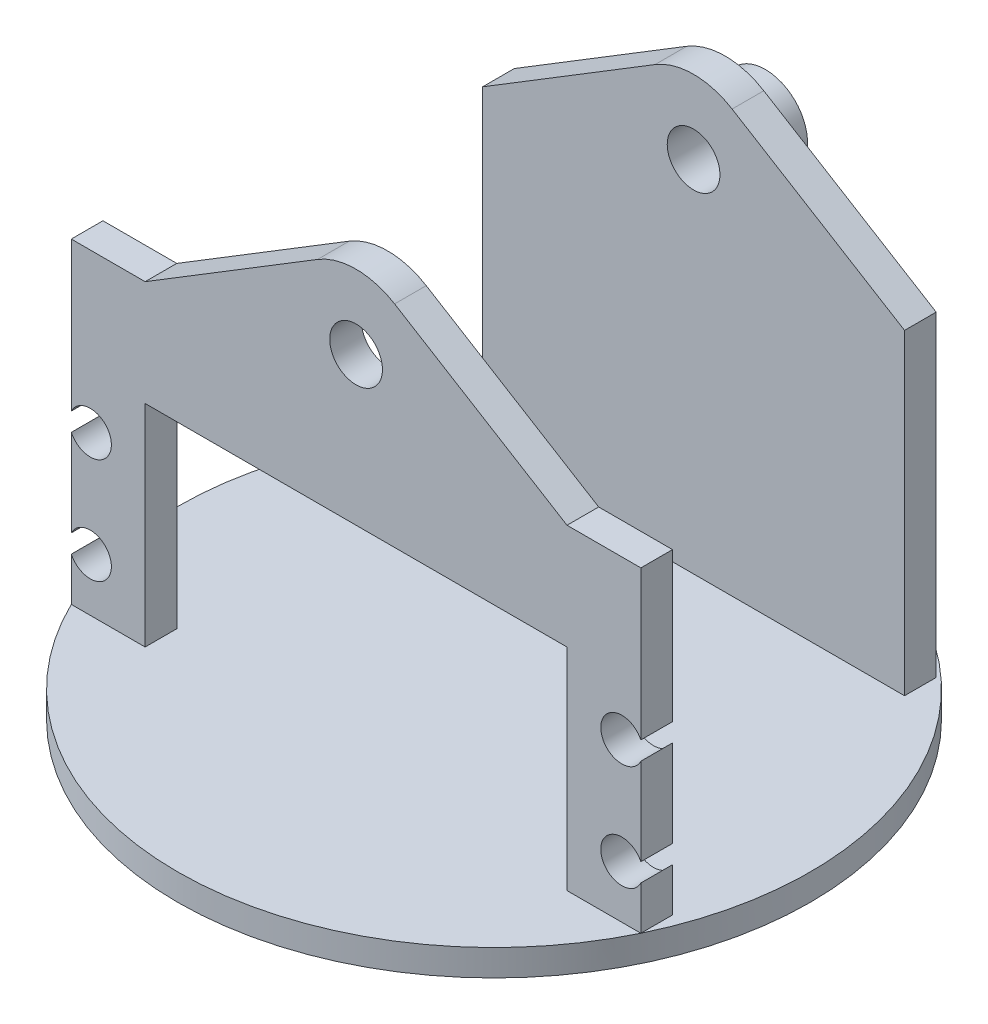
ISO-10303-21;
HEADER;
FILE_DESCRIPTION(('STEP AP214'),'2;1');
FILE_NAME('part.step','',(''),(''),'','','');
FILE_SCHEMA(('AUTOMOTIVE_DESIGN { 1 0 10303 214 1 1 1 1 }'));
ENDSEC;
DATA;
#1=APPLICATION_CONTEXT('core data for automotive mechanical design processes');
#2=APPLICATION_PROTOCOL_DEFINITION('international standard','automotive_design',2000,#1);
#3=PRODUCT_CONTEXT('',#1,'mechanical');
#4=PRODUCT('Part','Part','',(#3));
#5=PRODUCT_RELATED_PRODUCT_CATEGORY('part','',(#4));
#6=PRODUCT_DEFINITION_FORMATION('','',#4);
#7=PRODUCT_DEFINITION_CONTEXT('part definition',#1,'design');
#8=PRODUCT_DEFINITION('design','',#6,#7);
#9=PRODUCT_DEFINITION_SHAPE('','',#8);
#10=(LENGTH_UNIT() NAMED_UNIT(*) SI_UNIT(.MILLI.,.METRE.));
#11=(NAMED_UNIT(*) PLANE_ANGLE_UNIT() SI_UNIT($,.RADIAN.));
#12=(NAMED_UNIT(*) SI_UNIT($,.STERADIAN.) SOLID_ANGLE_UNIT());
#13=UNCERTAINTY_MEASURE_WITH_UNIT(LENGTH_MEASURE(1.E-05),#10,'distance_accuracy_value','');
#14=(GEOMETRIC_REPRESENTATION_CONTEXT(3) GLOBAL_UNCERTAINTY_ASSIGNED_CONTEXT((#13)) GLOBAL_UNIT_ASSIGNED_CONTEXT((#10,
#11,#12)) REPRESENTATION_CONTEXT('',''));
#15=CARTESIAN_POINT('',(0.,0.,0.));
#16=DIRECTION('',(0.,0.,1.));
#17=DIRECTION('',(1.,0.,0.));
#18=AXIS2_PLACEMENT_3D('',#15,#16,#17);
#19=CARTESIAN_POINT('',(0.,36.0286627923346,-21.923303169378));
#20=DIRECTION('',(0.,0.,-1.));
#21=DIRECTION('',(-1.,0.,0.));
#22=AXIS2_PLACEMENT_3D('',#19,#20,#21);
#23=PLANE('',#22);
#24=DIRECTION('',(-1.,0.,0.));
#25=VECTOR('',#24,1.);
#26=CARTESIAN_POINT('',(-20.,2.,-21.923303169378));
#27=LINE('',#26,#25);
#28=CARTESIAN_POINT('',(20.,2.,-21.923303169378));
#29=VERTEX_POINT('',#28);
#30=CARTESIAN_POINT('',(-20.,2.,-21.923303169378));
#31=VERTEX_POINT('',#30);
#32=EDGE_CURVE('E301',#29,#31,#27,.T.);
#33=ORIENTED_EDGE('',*,*,#32,.T.);
#34=DIRECTION('',(0.,1.,0.));
#35=VECTOR('',#34,1.);
#36=CARTESIAN_POINT('',(-20.,32.,-21.923303169378));
#37=LINE('',#36,#35);
#38=CARTESIAN_POINT('',(-20.,32.,-21.923303169378));
#39=VERTEX_POINT('',#38);
#40=EDGE_CURVE('E290',#31,#39,#37,.T.);
#41=ORIENTED_EDGE('',*,*,#40,.T.);
#42=DIRECTION('',(0.853048172523639,0.521832171635748,0.));
#43=VECTOR('',#42,1.);
#44=CARTESIAN_POINT('',(-3.65282520145023,42.,-21.923303169378));
#45=LINE('',#44,#43);
#46=CARTESIAN_POINT('',(-3.65282520145023,42.,-21.923303169378));
#47=VERTEX_POINT('',#46);
#48=EDGE_CURVE('E300',#39,#47,#45,.T.);
#49=ORIENTED_EDGE('',*,*,#48,.T.);
#50=CARTESIAN_POINT('',(0.,36.0286627923346,-21.923303169378));
#51=DIRECTION('',(0.,0.,-1.));
#52=DIRECTION('',(-1.,0.,0.));
#53=AXIS2_PLACEMENT_3D('',#50,#51,#52);
#54=CIRCLE('',#53,6.99999999999999);
#55=CARTESIAN_POINT('',(3.65282520145023,42.,-21.923303169378));
#56=VERTEX_POINT('',#55);
#57=EDGE_CURVE('E789',#47,#56,#54,.T.);
#58=ORIENTED_EDGE('',*,*,#57,.T.);
#59=DIRECTION('',(0.853048172523639,-0.521832171635747,0.));
#60=VECTOR('',#59,1.);
#61=CARTESIAN_POINT('',(20.,32.,-21.923303169378));
#62=LINE('',#61,#60);
#63=CARTESIAN_POINT('',(20.,32.,-21.923303169378));
#64=VERTEX_POINT('',#63);
#65=EDGE_CURVE('E792',#56,#64,#62,.T.);
#66=ORIENTED_EDGE('',*,*,#65,.T.);
#67=DIRECTION('',(0.,-1.,0.));
#68=VECTOR('',#67,1.);
#69=CARTESIAN_POINT('',(20.,2.,-21.923303169378));
#70=LINE('',#69,#68);
#71=EDGE_CURVE('E306',#64,#29,#70,.T.);
#72=ORIENTED_EDGE('',*,*,#71,.T.);
#73=EDGE_LOOP('',(#33,#41,#49,#58,#66,#72));
#74=FACE_BOUND('',#73,.T.);
#75=CARTESIAN_POINT('',(0.,36.0286627923346,-21.923303169378));
#76=DIRECTION('',(0.,0.,-1.));
#77=DIRECTION('',(-1.,0.,0.));
#78=AXIS2_PLACEMENT_3D('',#75,#76,#77);
#79=CIRCLE('',#78,4.);
#80=CARTESIAN_POINT('',(-4.,36.0286627923346,-21.923303169378));
#81=VERTEX_POINT('',#80);
#82=EDGE_CURVE('E777',#81,#81,#79,.T.);
#83=ORIENTED_EDGE('',*,*,#82,.F.);
#84=EDGE_LOOP('',(#83));
#85=FACE_BOUND('',#84,.T.);
#86=ADVANCED_FACE('F115',(#74,#85),#23,.T.);
#87=CARTESIAN_POINT('',(0.,2.,0.));
#88=DIRECTION('',(0.,1.,0.));
#89=DIRECTION('',(-1.,0.,0.));
#90=AXIS2_PLACEMENT_3D('',#87,#88,#89);
#91=PLANE('',#90);
#92=CARTESIAN_POINT('',(0.,2.00000000000001,0.));
#93=DIRECTION('',(0.,1.,0.));
#94=DIRECTION('',(-1.,0.,0.));
#95=AXIS2_PLACEMENT_3D('',#92,#93,#94);
#96=CIRCLE('',#95,30.);
#97=CARTESIAN_POINT('',(27.,2.00000000000001,13.076696830622));
#98=VERTEX_POINT('',#97);
#99=CARTESIAN_POINT('',(-27.,2.,13.076696830622));
#100=VERTEX_POINT('',#99);
#101=EDGE_CURVE('E511',#98,#100,#96,.T.);
#102=ORIENTED_EDGE('',*,*,#101,.T.);
#103=DIRECTION('',(0.,0.,-1.));
#104=VECTOR('',#103,1.);
#105=CARTESIAN_POINT('',(-27.,1.99999999999999,0.));
#106=LINE('',#105,#104);
#107=CARTESIAN_POINT('',(-27.,1.99999999999999,10.076696830622));
#108=VERTEX_POINT('',#107);
#109=EDGE_CURVE('E464',#100,#108,#106,.T.);
#110=ORIENTED_EDGE('',*,*,#109,.T.);
#111=DIRECTION('',(-1.,0.,0.));
#112=VECTOR('',#111,1.);
#113=CARTESIAN_POINT('',(0.,2.,10.076696830622));
#114=LINE('',#113,#112);
#115=CARTESIAN_POINT('',(-20.,2.,10.076696830622));
#116=VERTEX_POINT('',#115);
#117=EDGE_CURVE('E459',#116,#108,#114,.T.);
#118=ORIENTED_EDGE('',*,*,#117,.F.);
#119=DIRECTION('',(0.,0.,1.));
#120=VECTOR('',#119,1.);
#121=CARTESIAN_POINT('',(-20.,2.,-30.001));
#122=LINE('',#121,#120);
#123=CARTESIAN_POINT('',(-20.,2.,13.076696830622));
#124=VERTEX_POINT('',#123);
#125=EDGE_CURVE('E420',#116,#124,#122,.T.);
#126=ORIENTED_EDGE('',*,*,#125,.T.);
#127=DIRECTION('',(-1.,0.,0.));
#128=VECTOR('',#127,1.);
#129=CARTESIAN_POINT('',(0.,2.,13.076696830622));
#130=LINE('',#129,#128);
#131=EDGE_CURVE('E432',#124,#100,#130,.T.);
#132=ORIENTED_EDGE('',*,*,#131,.T.);
#133=EDGE_CURVE('E512',#100,#98,#96,.T.);
#134=ORIENTED_EDGE('',*,*,#133,.T.);
#135=CARTESIAN_POINT('',(20.,2.,13.076696830622));
#136=VERTEX_POINT('',#135);
#137=EDGE_CURVE('E451',#98,#136,#130,.T.);
#138=ORIENTED_EDGE('',*,*,#137,.T.);
#139=DIRECTION('',(0.,0.,1.));
#140=VECTOR('',#139,1.);
#141=CARTESIAN_POINT('',(20.,2.,-30.001));
#142=LINE('',#141,#140);
#143=CARTESIAN_POINT('',(20.,2.,10.076696830622));
#144=VERTEX_POINT('',#143);
#145=EDGE_CURVE('E416',#144,#136,#142,.T.);
#146=ORIENTED_EDGE('',*,*,#145,.F.);
#147=CARTESIAN_POINT('',(27.,2.00000000000001,10.076696830622));
#148=VERTEX_POINT('',#147);
#149=EDGE_CURVE('E460',#148,#144,#114,.T.);
#150=ORIENTED_EDGE('',*,*,#149,.F.);
#151=DIRECTION('',(0.,0.,-1.));
#152=VECTOR('',#151,1.);
#153=CARTESIAN_POINT('',(27.,2.00000000000001,0.));
#154=LINE('',#153,#152);
#155=EDGE_CURVE('E455',#98,#148,#154,.T.);
#156=ORIENTED_EDGE('',*,*,#155,.F.);
#157=EDGE_LOOP('',(#102,#110,#118,#126,#132,#134,#138,#146,#150,#156));
#158=FACE_BOUND('',#157,.T.);
#159=DIRECTION('',(-1.,0.,0.));
#160=VECTOR('',#159,1.);
#161=CARTESIAN_POINT('',(-20.,2.,-18.923303169378));
#162=LINE('',#161,#160);
#163=CARTESIAN_POINT('',(20.,2.00000000000001,-18.923303169378));
#164=VERTEX_POINT('',#163);
#165=CARTESIAN_POINT('',(-20.,2.,-18.923303169378));
#166=VERTEX_POINT('',#165);
#167=EDGE_CURVE('E131',#164,#166,#162,.T.);
#168=ORIENTED_EDGE('',*,*,#167,.T.);
#169=DIRECTION('',(0.,0.,1.));
#170=VECTOR('',#169,1.);
#171=CARTESIAN_POINT('',(-20.,2.,-21.923303169378));
#172=LINE('',#171,#170);
#173=EDGE_CURVE('E294',#31,#166,#172,.T.);
#174=ORIENTED_EDGE('',*,*,#173,.F.);
#175=ORIENTED_EDGE('',*,*,#32,.F.);
#176=DIRECTION('',(0.,0.,1.));
#177=VECTOR('',#176,1.);
#178=CARTESIAN_POINT('',(20.,2.,-21.923303169378));
#179=LINE('',#178,#177);
#180=EDGE_CURVE('E797',#29,#164,#179,.T.);
#181=ORIENTED_EDGE('',*,*,#180,.T.);
#182=EDGE_LOOP('',(#168,#174,#175,#181));
#183=FACE_BOUND('',#182,.T.);
#184=ADVANCED_FACE('F313',(#158,#183),#91,.T.);
#185=CARTESIAN_POINT('',(0.,32.,0.));
#186=DIRECTION('',(0.,1.,0.));
#187=DIRECTION('',(-1.,0.,0.));
#188=AXIS2_PLACEMENT_3D('',#185,#186,#187);
#189=PLANE('',#188);
#190=DIRECTION('',(-1.,0.,0.));
#191=VECTOR('',#190,1.);
#192=CARTESIAN_POINT('',(0.,32.,10.076696830622));
#193=LINE('',#192,#191);
#194=CARTESIAN_POINT('',(27.,32.,10.076696830622));
#195=VERTEX_POINT('',#194);
#196=CARTESIAN_POINT('',(20.,32.,10.076696830622));
#197=VERTEX_POINT('',#196);
#198=EDGE_CURVE('E442',#195,#197,#193,.T.);
#199=ORIENTED_EDGE('',*,*,#198,.T.);
#200=DIRECTION('',(0.,0.,1.));
#201=VECTOR('',#200,1.);
#202=CARTESIAN_POINT('',(20.,32.,10.076696830622));
#203=LINE('',#202,#201);
#204=CARTESIAN_POINT('',(20.,32.,13.076696830622));
#205=VERTEX_POINT('',#204);
#206=EDGE_CURVE('E336',#197,#205,#203,.T.);
#207=ORIENTED_EDGE('',*,*,#206,.T.);
#208=DIRECTION('',(-1.,0.,0.));
#209=VECTOR('',#208,1.);
#210=CARTESIAN_POINT('',(0.,32.,13.076696830622));
#211=LINE('',#210,#209);
#212=CARTESIAN_POINT('',(27.,32.,13.076696830622));
#213=VERTEX_POINT('',#212);
#214=EDGE_CURVE('E433',#213,#205,#211,.T.);
#215=ORIENTED_EDGE('',*,*,#214,.F.);
#216=DIRECTION('',(0.,0.,-1.));
#217=VECTOR('',#216,1.);
#218=CARTESIAN_POINT('',(27.,32.,0.));
#219=LINE('',#218,#217);
#220=EDGE_CURVE('E437',#213,#195,#219,.T.);
#221=ORIENTED_EDGE('',*,*,#220,.T.);
#222=EDGE_LOOP('',(#199,#207,#215,#221));
#223=FACE_BOUND('',#222,.T.);
#224=ADVANCED_FACE('F623',(#223),#189,.T.);
#225=CARTESIAN_POINT('',(27.,32.,0.));
#226=DIRECTION('',(-1.,0.,0.));
#227=DIRECTION('',(0.,-1.,0.));
#228=AXIS2_PLACEMENT_3D('',#225,#226,#227);
#229=PLANE('',#228);
#230=DIRECTION('',(0.,0.,1.));
#231=VECTOR('',#230,1.);
#232=CARTESIAN_POINT('',(27.,16.1282202112919,3.07669683062201));
#233=LINE('',#232,#231);
#234=CARTESIAN_POINT('',(27.,16.1282202112919,10.076696830622));
#235=VERTEX_POINT('',#234);
#236=CARTESIAN_POINT('',(27.,16.1282202112919,13.076696830622));
#237=VERTEX_POINT('',#236);
#238=EDGE_CURVE('E368',#235,#237,#233,.T.);
#239=ORIENTED_EDGE('',*,*,#238,.T.);
#240=DIRECTION('',(0.,-1.,0.));
#241=VECTOR('',#240,1.);
#242=CARTESIAN_POINT('',(27.,32.,13.076696830622));
#243=LINE('',#242,#241);
#244=CARTESIAN_POINT('',(27.,7.87177978870814,13.076696830622));
#245=VERTEX_POINT('',#244);
#246=EDGE_CURVE('E491',#237,#245,#243,.T.);
#247=ORIENTED_EDGE('',*,*,#246,.T.);
#248=DIRECTION('',(0.,0.,1.));
#249=VECTOR('',#248,1.);
#250=CARTESIAN_POINT('',(27.,7.87177978870814,3.07669683062201));
#251=LINE('',#250,#249);
#252=CARTESIAN_POINT('',(27.,7.87177978870814,10.076696830622));
#253=VERTEX_POINT('',#252);
#254=EDGE_CURVE('E378',#253,#245,#251,.T.);
#255=ORIENTED_EDGE('',*,*,#254,.F.);
#256=DIRECTION('',(0.,-1.,0.));
#257=VECTOR('',#256,1.);
#258=CARTESIAN_POINT('',(27.,32.,10.076696830622));
#259=LINE('',#258,#257);
#260=EDGE_CURVE('E485',#235,#253,#259,.T.);
#261=ORIENTED_EDGE('',*,*,#260,.F.);
#262=EDGE_LOOP('',(#239,#247,#255,#261));
#263=FACE_BOUND('',#262,.T.);
#264=ADVANCED_FACE('F538',(#263),#229,.F.);
#265=DIRECTION('',(0.,0.,1.));
#266=VECTOR('',#265,1.);
#267=CARTESIAN_POINT('',(27.,17.8717797887081,3.07669683062201));
#268=LINE('',#267,#266);
#269=CARTESIAN_POINT('',(27.,17.8717797887081,10.076696830622));
#270=VERTEX_POINT('',#269);
#271=CARTESIAN_POINT('',(27.,17.8717797887081,13.076696830622));
#272=VERTEX_POINT('',#271);
#273=EDGE_CURVE('E366',#270,#272,#268,.T.);
#274=ORIENTED_EDGE('',*,*,#273,.F.);
#275=EDGE_CURVE('E480',#195,#270,#259,.T.);
#276=ORIENTED_EDGE('',*,*,#275,.F.);
#277=ORIENTED_EDGE('',*,*,#220,.F.);
#278=EDGE_CURVE('E486',#213,#272,#243,.T.);
#279=ORIENTED_EDGE('',*,*,#278,.T.);
#280=EDGE_LOOP('',(#274,#276,#277,#279));
#281=FACE_BOUND('',#280,.T.);
#282=ADVANCED_FACE('F628',(#281),#229,.F.);
#283=DIRECTION('',(0.,0.,1.));
#284=VECTOR('',#283,1.);
#285=CARTESIAN_POINT('',(27.,6.12822021129186,3.07669683062201));
#286=LINE('',#285,#284);
#287=CARTESIAN_POINT('',(27.,6.12822021129185,10.076696830622));
#288=VERTEX_POINT('',#287);
#289=CARTESIAN_POINT('',(27.,6.12822021129186,13.076696830622));
#290=VERTEX_POINT('',#289);
#291=EDGE_CURVE('E367',#288,#290,#286,.T.);
#292=ORIENTED_EDGE('',*,*,#291,.T.);
#293=EDGE_CURVE('E484',#290,#98,#243,.T.);
#294=ORIENTED_EDGE('',*,*,#293,.T.);
#295=ORIENTED_EDGE('',*,*,#155,.T.);
#296=EDGE_CURVE('E478',#288,#148,#259,.T.);
#297=ORIENTED_EDGE('',*,*,#296,.F.);
#298=EDGE_LOOP('',(#292,#294,#295,#297));
#299=FACE_BOUND('',#298,.T.);
#300=ADVANCED_FACE('F552',(#299),#229,.F.);
#301=CARTESIAN_POINT('',(-27.,32.,0.));
#302=DIRECTION('',(-1.,0.,0.));
#303=DIRECTION('',(0.,0.,1.));
#304=AXIS2_PLACEMENT_3D('',#301,#302,#303);
#305=PLANE('',#304);
#306=DIRECTION('',(0.,0.,1.));
#307=VECTOR('',#306,1.);
#308=CARTESIAN_POINT('',(-27.,16.1282202112919,3.07669683062201));
#309=LINE('',#308,#307);
#310=CARTESIAN_POINT('',(-27.,16.1282202112919,10.076696830622));
#311=VERTEX_POINT('',#310);
#312=CARTESIAN_POINT('',(-27.,16.1282202112919,13.076696830622));
#313=VERTEX_POINT('',#312);
#314=EDGE_CURVE('E525',#311,#313,#309,.T.);
#315=ORIENTED_EDGE('',*,*,#314,.F.);
#316=DIRECTION('',(0.,-1.,0.));
#317=VECTOR('',#316,1.);
#318=CARTESIAN_POINT('',(-27.,32.,10.076696830622));
#319=LINE('',#318,#317);
#320=CARTESIAN_POINT('',(-27.,7.87177978870814,10.076696830622));
#321=VERTEX_POINT('',#320);
#322=EDGE_CURVE('E479',#311,#321,#319,.T.);
#323=ORIENTED_EDGE('',*,*,#322,.T.);
#324=DIRECTION('',(0.,0.,1.));
#325=VECTOR('',#324,1.);
#326=CARTESIAN_POINT('',(-27.,7.87177978870815,3.07669683062201));
#327=LINE('',#326,#325);
#328=CARTESIAN_POINT('',(-27.,7.87177978870814,13.076696830622));
#329=VERTEX_POINT('',#328);
#330=EDGE_CURVE('E516',#329,#321,#327,.F.);
#331=ORIENTED_EDGE('',*,*,#330,.F.);
#332=DIRECTION('',(0.,-1.,0.));
#333=VECTOR('',#332,1.);
#334=CARTESIAN_POINT('',(-27.,32.,13.076696830622));
#335=LINE('',#334,#333);
#336=EDGE_CURVE('E473',#313,#329,#335,.T.);
#337=ORIENTED_EDGE('',*,*,#336,.F.);
#338=EDGE_LOOP('',(#315,#323,#331,#337));
#339=FACE_BOUND('',#338,.T.);
#340=ADVANCED_FACE('F590',(#339),#305,.T.);
#341=DIRECTION('',(0.,0.,1.));
#342=VECTOR('',#341,1.);
#343=CARTESIAN_POINT('',(-27.,6.12822021129184,3.07669683062201));
#344=LINE('',#343,#342);
#345=CARTESIAN_POINT('',(-27.,6.12822021129186,10.076696830622));
#346=VERTEX_POINT('',#345);
#347=CARTESIAN_POINT('',(-27.,6.12822021129186,13.076696830622));
#348=VERTEX_POINT('',#347);
#349=EDGE_CURVE('E519',#346,#348,#344,.T.);
#350=ORIENTED_EDGE('',*,*,#349,.F.);
#351=EDGE_CURVE('E472',#346,#108,#319,.T.);
#352=ORIENTED_EDGE('',*,*,#351,.T.);
#353=ORIENTED_EDGE('',*,*,#109,.F.);
#354=EDGE_CURVE('E450',#348,#100,#335,.T.);
#355=ORIENTED_EDGE('',*,*,#354,.F.);
#356=EDGE_LOOP('',(#350,#352,#353,#355));
#357=FACE_BOUND('',#356,.T.);
#358=ADVANCED_FACE('F568',(#357),#305,.T.);
#359=CARTESIAN_POINT('',(-2.9,0.,0.));
#360=DIRECTION('',(0.,-1.,0.));
#361=DIRECTION('',(1.,0.,0.));
#362=AXIS2_PLACEMENT_3D('',#359,#360,#361);
#363=PLANE('',#362);
#364=CARTESIAN_POINT('',(0.,0.,0.));
#365=DIRECTION('',(0.,1.,0.));
#366=DIRECTION('',(-1.,0.,0.));
#367=AXIS2_PLACEMENT_3D('',#364,#365,#366);
#368=CIRCLE('',#367,2.89999999999999);
#369=CARTESIAN_POINT('',(-2.9,0.,0.));
#370=VERTEX_POINT('',#369);
#371=EDGE_CURVE('E490',#370,#370,#368,.T.);
#372=ORIENTED_EDGE('',*,*,#371,.F.);
#373=EDGE_LOOP('',(#372));
#374=FACE_BOUND('',#373,.T.);
#375=ADVANCED_FACE('F117',(#374),#363,.T.);
#376=CARTESIAN_POINT('',(0.,5.26927704004386,0.));
#377=DIRECTION('',(0.,1.,0.));
#378=DIRECTION('',(-1.,0.,0.));
#379=AXIS2_PLACEMENT_3D('',#376,#377,#378);
#380=CYLINDRICAL_SURFACE('',#379,30.);
#381=CARTESIAN_POINT('',(0.,-0.499999999999991,0.));
#382=DIRECTION('',(0.,1.,0.));
#383=DIRECTION('',(-1.,0.,0.));
#384=AXIS2_PLACEMENT_3D('',#381,#382,#383);
#385=CIRCLE('',#384,30.);
#386=CARTESIAN_POINT('',(-30.,-0.5,0.));
#387=VERTEX_POINT('',#386);
#388=EDGE_CURVE('E507',#387,#387,#385,.T.);
#389=ORIENTED_EDGE('',*,*,#388,.T.);
#390=EDGE_LOOP('',(#389));
#391=FACE_BOUND('',#390,.T.);
#392=ORIENTED_EDGE('',*,*,#133,.F.);
#393=ORIENTED_EDGE('',*,*,#101,.F.);
#394=EDGE_LOOP('',(#392,#393));
#395=FACE_BOUND('',#394,.T.);
#396=ADVANCED_FACE('F563',(#391,#395),#380,.T.);
#397=CARTESIAN_POINT('',(-30.,-0.500000000000004,0.));
#398=DIRECTION('',(0.,-1.,0.));
#399=DIRECTION('',(1.,0.,0.));
#400=AXIS2_PLACEMENT_3D('',#397,#398,#399);
#401=PLANE('',#400);
#402=CARTESIAN_POINT('',(0.,-0.499999999999999,0.));
#403=DIRECTION('',(0.,1.,0.));
#404=DIRECTION('',(-1.,0.,0.));
#405=AXIS2_PLACEMENT_3D('',#402,#403,#404);
#406=CIRCLE('',#405,5.5);
#407=CARTESIAN_POINT('',(-5.5,-0.5,0.));
#408=VERTEX_POINT('',#407);
#409=EDGE_CURVE('E503',#408,#408,#406,.T.);
#410=ORIENTED_EDGE('',*,*,#409,.T.);
#411=EDGE_LOOP('',(#410));
#412=FACE_BOUND('',#411,.T.);
#413=ORIENTED_EDGE('',*,*,#388,.F.);
#414=EDGE_LOOP('',(#413));
#415=FACE_BOUND('',#414,.T.);
#416=ADVANCED_FACE('F1010',(#412,#415),#401,.T.);
#417=CARTESIAN_POINT('',(0.,5.26927704004386,0.));
#418=DIRECTION('',(0.,1.,0.));
#419=DIRECTION('',(-1.,0.,0.));
#420=AXIS2_PLACEMENT_3D('',#417,#418,#419);
#421=CYLINDRICAL_SURFACE('',#420,5.5);
#422=CARTESIAN_POINT('',(0.,-2.75,0.));
#423=DIRECTION('',(0.,1.,0.));
#424=DIRECTION('',(-1.,0.,0.));
#425=AXIS2_PLACEMENT_3D('',#422,#423,#424);
#426=CIRCLE('',#425,5.5);
#427=CARTESIAN_POINT('',(-5.5,-2.75,0.));
#428=VERTEX_POINT('',#427);
#429=EDGE_CURVE('E499',#428,#428,#426,.T.);
#430=ORIENTED_EDGE('',*,*,#429,.T.);
#431=EDGE_LOOP('',(#430));
#432=FACE_BOUND('',#431,.T.);
#433=ORIENTED_EDGE('',*,*,#409,.F.);
#434=EDGE_LOOP('',(#433));
#435=FACE_BOUND('',#434,.T.);
#436=ADVANCED_FACE('F1001',(#432,#435),#421,.T.);
#437=CARTESIAN_POINT('',(-5.5,-2.75,0.));
#438=DIRECTION('',(0.,-1.,0.));
#439=DIRECTION('',(1.,0.,0.));
#440=AXIS2_PLACEMENT_3D('',#437,#438,#439);
#441=PLANE('',#440);
#442=CARTESIAN_POINT('',(0.,-2.75,0.));
#443=DIRECTION('',(0.,1.,0.));
#444=DIRECTION('',(-1.,0.,0.));
#445=AXIS2_PLACEMENT_3D('',#442,#443,#444);
#446=CIRCLE('',#445,2.9);
#447=CARTESIAN_POINT('',(-2.9,-2.75,0.));
#448=VERTEX_POINT('',#447);
#449=EDGE_CURVE('E495',#448,#448,#446,.T.);
#450=ORIENTED_EDGE('',*,*,#449,.T.);
#451=EDGE_LOOP('',(#450));
#452=FACE_BOUND('',#451,.T.);
#453=ORIENTED_EDGE('',*,*,#429,.F.);
#454=EDGE_LOOP('',(#453));
#455=FACE_BOUND('',#454,.T.);
#456=ADVANCED_FACE('F992',(#452,#455),#441,.T.);
#457=CARTESIAN_POINT('',(0.,5.26927704004386,0.));
#458=DIRECTION('',(0.,1.,0.));
#459=DIRECTION('',(-1.,0.,0.));
#460=AXIS2_PLACEMENT_3D('',#457,#458,#459);
#461=CYLINDRICAL_SURFACE('',#460,2.9);
#462=ORIENTED_EDGE('',*,*,#371,.T.);
#463=EDGE_LOOP('',(#462));
#464=FACE_BOUND('',#463,.T.);
#465=ORIENTED_EDGE('',*,*,#449,.F.);
#466=EDGE_LOOP('',(#465));
#467=FACE_BOUND('',#466,.T.);
#468=ADVANCED_FACE('F984',(#464,#467),#461,.F.);
#469=CARTESIAN_POINT('',(0.,32.,13.076696830622));
#470=DIRECTION('',(0.,0.,1.));
#471=DIRECTION('',(1.,0.,0.));
#472=AXIS2_PLACEMENT_3D('',#469,#470,#471);
#473=PLANE('',#472);
#474=ORIENTED_EDGE('',*,*,#246,.F.);
#475=CARTESIAN_POINT('',(25.2,17.,13.076696830622));
#476=DIRECTION('',(0.,0.,-1.));
#477=DIRECTION('',(-1.,0.,0.));
#478=AXIS2_PLACEMENT_3D('',#475,#476,#477);
#479=CIRCLE('',#478,2.);
#480=EDGE_CURVE('E362',#237,#272,#479,.T.);
#481=ORIENTED_EDGE('',*,*,#480,.T.);
#482=ORIENTED_EDGE('',*,*,#278,.F.);
#483=ORIENTED_EDGE('',*,*,#214,.T.);
#484=DIRECTION('',(0.853048172523639,-0.521832171635747,0.));
#485=VECTOR('',#484,1.);
#486=CARTESIAN_POINT('',(19.6909116791749,32.1890775162278,13.076696830622));
#487=LINE('',#486,#485);
#488=CARTESIAN_POINT('',(3.65282520145023,42.,13.076696830622));
#489=VERTEX_POINT('',#488);
#490=EDGE_CURVE('E139',#489,#205,#487,.T.);
#491=ORIENTED_EDGE('',*,*,#490,.F.);
#492=CARTESIAN_POINT('',(0.,36.0286627923346,13.076696830622));
#493=DIRECTION('',(0.,0.,1.));
#494=DIRECTION('',(1.,0.,0.));
#495=AXIS2_PLACEMENT_3D('',#492,#493,#494);
#496=CIRCLE('',#495,7.);
#497=CARTESIAN_POINT('',(-3.65282520145023,42.,13.076696830622));
#498=VERTEX_POINT('',#497);
#499=EDGE_CURVE('E337',#489,#498,#496,.T.);
#500=ORIENTED_EDGE('',*,*,#499,.T.);
#501=DIRECTION('',(0.853048172523639,0.521832171635748,0.));
#502=VECTOR('',#501,1.);
#503=CARTESIAN_POINT('',(-20.,32.,13.076696830622));
#504=LINE('',#503,#502);
#505=CARTESIAN_POINT('',(-20.,32.,13.076696830622));
#506=VERTEX_POINT('',#505);
#507=EDGE_CURVE('E315',#506,#498,#504,.T.);
#508=ORIENTED_EDGE('',*,*,#507,.F.);
#509=CARTESIAN_POINT('',(-27.,32.,13.076696830622));
#510=VERTEX_POINT('',#509);
#511=EDGE_CURVE('E438',#506,#510,#211,.T.);
#512=ORIENTED_EDGE('',*,*,#511,.T.);
#513=CARTESIAN_POINT('',(-27.,17.8717797887081,13.076696830622));
#514=VERTEX_POINT('',#513);
#515=EDGE_CURVE('E468',#510,#514,#335,.T.);
#516=ORIENTED_EDGE('',*,*,#515,.T.);
#517=CARTESIAN_POINT('',(-25.2,17.,13.076696830622));
#518=DIRECTION('',(0.,0.,1.));
#519=DIRECTION('',(1.,0.,0.));
#520=AXIS2_PLACEMENT_3D('',#517,#518,#519);
#521=CIRCLE('',#520,2.);
#522=EDGE_CURVE('E384',#313,#514,#521,.T.);
#523=ORIENTED_EDGE('',*,*,#522,.F.);
#524=ORIENTED_EDGE('',*,*,#336,.T.);
#525=CARTESIAN_POINT('',(-25.2,7.,13.076696830622));
#526=DIRECTION('',(0.,0.,1.));
#527=DIRECTION('',(1.,0.,0.));
#528=AXIS2_PLACEMENT_3D('',#525,#526,#527);
#529=CIRCLE('',#528,2.);
#530=EDGE_CURVE('E372',#348,#329,#529,.T.);
#531=ORIENTED_EDGE('',*,*,#530,.F.);
#532=ORIENTED_EDGE('',*,*,#354,.T.);
#533=ORIENTED_EDGE('',*,*,#131,.F.);
#534=DIRECTION('',(0.,-1.,0.));
#535=VECTOR('',#534,1.);
#536=CARTESIAN_POINT('',(-20.,22.,13.076696830622));
#537=LINE('',#536,#535);
#538=CARTESIAN_POINT('',(-20.,22.,13.076696830622));
#539=VERTEX_POINT('',#538);
#540=EDGE_CURVE('E411',#539,#124,#537,.T.);
#541=ORIENTED_EDGE('',*,*,#540,.F.);
#542=DIRECTION('',(-1.,0.,0.));
#543=VECTOR('',#542,1.);
#544=CARTESIAN_POINT('',(20.,22.,13.076696830622));
#545=LINE('',#544,#543);
#546=CARTESIAN_POINT('',(20.,22.,13.076696830622));
#547=VERTEX_POINT('',#546);
#548=EDGE_CURVE('E407',#547,#539,#545,.T.);
#549=ORIENTED_EDGE('',*,*,#548,.F.);
#550=DIRECTION('',(0.,1.,0.));
#551=VECTOR('',#550,1.);
#552=CARTESIAN_POINT('',(20.,22.,13.076696830622));
#553=LINE('',#552,#551);
#554=EDGE_CURVE('E404',#136,#547,#553,.T.);
#555=ORIENTED_EDGE('',*,*,#554,.F.);
#556=ORIENTED_EDGE('',*,*,#137,.F.);
#557=ORIENTED_EDGE('',*,*,#293,.F.);
#558=CARTESIAN_POINT('',(25.2,7.,13.076696830622));
#559=DIRECTION('',(0.,0.,-1.));
#560=DIRECTION('',(-1.,0.,0.));
#561=AXIS2_PLACEMENT_3D('',#558,#559,#560);
#562=CIRCLE('',#561,2.);
#563=EDGE_CURVE('E350',#290,#245,#562,.T.);
#564=ORIENTED_EDGE('',*,*,#563,.T.);
#565=EDGE_LOOP('',(#474,#481,#482,#483,#491,#500,#508,#512,#516,#523,#524,#531,#532,#533,#541,
#549,#555,#556,#557,#564));
#566=FACE_BOUND('',#565,.T.);
#567=CARTESIAN_POINT('',(0.,36.0286627923346,13.076696830622));
#568=DIRECTION('',(0.,0.,1.));
#569=DIRECTION('',(1.,0.,0.));
#570=AXIS2_PLACEMENT_3D('',#567,#568,#569);
#571=CIRCLE('',#570,2.5);
#572=CARTESIAN_POINT('',(2.5,36.0286627923346,13.076696830622));
#573=VERTEX_POINT('',#572);
#574=EDGE_CURVE('E340',#573,#573,#571,.T.);
#575=ORIENTED_EDGE('',*,*,#574,.F.);
#576=EDGE_LOOP('',(#575));
#577=FACE_BOUND('',#576,.T.);
#578=ADVANCED_FACE('F578',(#566,#577),#473,.T.);
#579=CARTESIAN_POINT('',(0.,32.,10.076696830622));
#580=DIRECTION('',(0.,0.,1.));
#581=DIRECTION('',(1.,0.,0.));
#582=AXIS2_PLACEMENT_3D('',#579,#580,#581);
#583=PLANE('',#582);
#584=CARTESIAN_POINT('',(25.2,17.,10.076696830622));
#585=DIRECTION('',(0.,0.,1.));
#586=DIRECTION('',(1.,0.,0.));
#587=AXIS2_PLACEMENT_3D('',#584,#585,#586);
#588=CIRCLE('',#587,2.);
#589=EDGE_CURVE('E12',#235,#270,#588,.F.);
#590=ORIENTED_EDGE('',*,*,#589,.F.);
#591=ORIENTED_EDGE('',*,*,#260,.T.);
#592=CARTESIAN_POINT('',(25.2,7.,10.076696830622));
#593=DIRECTION('',(0.,0.,1.));
#594=DIRECTION('',(1.,0.,0.));
#595=AXIS2_PLACEMENT_3D('',#592,#593,#594);
#596=CIRCLE('',#595,2.);
#597=EDGE_CURVE('E124',#288,#253,#596,.F.);
#598=ORIENTED_EDGE('',*,*,#597,.F.);
#599=ORIENTED_EDGE('',*,*,#296,.T.);
#600=ORIENTED_EDGE('',*,*,#149,.T.);
#601=DIRECTION('',(0.,-1.,0.));
#602=VECTOR('',#601,1.);
#603=CARTESIAN_POINT('',(20.,22.,10.076696830622));
#604=LINE('',#603,#602);
#605=CARTESIAN_POINT('',(20.,22.,10.076696830622));
#606=VERTEX_POINT('',#605);
#607=EDGE_CURVE('E400',#606,#144,#604,.T.);
#608=ORIENTED_EDGE('',*,*,#607,.F.);
#609=DIRECTION('',(1.,0.,0.));
#610=VECTOR('',#609,1.);
#611=CARTESIAN_POINT('',(20.,22.,10.076696830622));
#612=LINE('',#611,#610);
#613=CARTESIAN_POINT('',(-20.,22.,10.076696830622));
#614=VERTEX_POINT('',#613);
#615=EDGE_CURVE('E419',#614,#606,#612,.T.);
#616=ORIENTED_EDGE('',*,*,#615,.F.);
#617=DIRECTION('',(0.,1.,0.));
#618=VECTOR('',#617,1.);
#619=CARTESIAN_POINT('',(-20.,22.,10.076696830622));
#620=LINE('',#619,#618);
#621=EDGE_CURVE('E397',#116,#614,#620,.T.);
#622=ORIENTED_EDGE('',*,*,#621,.F.);
#623=ORIENTED_EDGE('',*,*,#117,.T.);
#624=ORIENTED_EDGE('',*,*,#351,.F.);
#625=CARTESIAN_POINT('',(-25.2,7.,10.076696830622));
#626=DIRECTION('',(0.,0.,1.));
#627=DIRECTION('',(1.,0.,0.));
#628=AXIS2_PLACEMENT_3D('',#625,#626,#627);
#629=CIRCLE('',#628,2.);
#630=EDGE_CURVE('E387',#346,#321,#629,.T.);
#631=ORIENTED_EDGE('',*,*,#630,.T.);
#632=ORIENTED_EDGE('',*,*,#322,.F.);
#633=CARTESIAN_POINT('',(-25.2,17.,10.076696830622));
#634=DIRECTION('',(0.,0.,1.));
#635=DIRECTION('',(1.,0.,0.));
#636=AXIS2_PLACEMENT_3D('',#633,#634,#635);
#637=CIRCLE('',#636,2.);
#638=CARTESIAN_POINT('',(-27.,17.8717797887081,10.076696830622));
#639=VERTEX_POINT('',#638);
#640=EDGE_CURVE('E393',#311,#639,#637,.T.);
#641=ORIENTED_EDGE('',*,*,#640,.T.);
#642=CARTESIAN_POINT('',(-27.,32.,10.076696830622));
#643=VERTEX_POINT('',#642);
#644=EDGE_CURVE('E474',#643,#639,#319,.T.);
#645=ORIENTED_EDGE('',*,*,#644,.F.);
#646=CARTESIAN_POINT('',(-20.,32.,10.076696830622));
#647=VERTEX_POINT('',#646);
#648=EDGE_CURVE('E441',#647,#643,#193,.T.);
#649=ORIENTED_EDGE('',*,*,#648,.F.);
#650=DIRECTION('',(0.853048172523639,0.521832171635748,0.));
#651=VECTOR('',#650,1.);
#652=CARTESIAN_POINT('',(-20.,32.,10.076696830622));
#653=LINE('',#652,#651);
#654=CARTESIAN_POINT('',(-3.65282520145023,42.,10.076696830622));
#655=VERTEX_POINT('',#654);
#656=EDGE_CURVE('E320',#647,#655,#653,.T.);
#657=ORIENTED_EDGE('',*,*,#656,.T.);
#658=CARTESIAN_POINT('',(0.,36.0286627923346,10.076696830622));
#659=DIRECTION('',(0.,0.,1.));
#660=DIRECTION('',(1.,0.,0.));
#661=AXIS2_PLACEMENT_3D('',#658,#659,#660);
#662=CIRCLE('',#661,7.);
#663=CARTESIAN_POINT('',(3.65282520145023,42.,10.076696830622));
#664=VERTEX_POINT('',#663);
#665=EDGE_CURVE('E326',#664,#655,#662,.T.);
#666=ORIENTED_EDGE('',*,*,#665,.F.);
#667=DIRECTION('',(0.853048172523639,-0.521832171635747,0.));
#668=VECTOR('',#667,1.);
#669=CARTESIAN_POINT('',(19.6909116791749,32.1890775162278,10.076696830622));
#670=LINE('',#669,#668);
#671=EDGE_CURVE('E333',#664,#197,#670,.T.);
#672=ORIENTED_EDGE('',*,*,#671,.T.);
#673=ORIENTED_EDGE('',*,*,#198,.F.);
#674=ORIENTED_EDGE('',*,*,#275,.T.);
#675=EDGE_LOOP('',(#590,#591,#598,#599,#600,#608,#616,#622,#623,#624,#631,#632,#641,#645,#649,
#657,#666,#672,#673,#674));
#676=FACE_BOUND('',#675,.T.);
#677=CARTESIAN_POINT('',(0.,36.0286627923346,10.076696830622));
#678=DIRECTION('',(0.,0.,1.));
#679=DIRECTION('',(1.,0.,0.));
#680=AXIS2_PLACEMENT_3D('',#677,#678,#679);
#681=CIRCLE('',#680,2.5);
#682=CARTESIAN_POINT('',(2.5,36.0286627923346,10.076696830622));
#683=VERTEX_POINT('',#682);
#684=EDGE_CURVE('E329',#683,#683,#681,.T.);
#685=ORIENTED_EDGE('',*,*,#684,.T.);
#686=EDGE_LOOP('',(#685));
#687=FACE_BOUND('',#686,.T.);
#688=ADVANCED_FACE('F541',(#676,#687),#583,.F.);
#689=DIRECTION('',(0.,0.,1.));
#690=VECTOR('',#689,1.);
#691=CARTESIAN_POINT('',(-27.,17.8717797887081,3.07669683062201));
#692=LINE('',#691,#690);
#693=EDGE_CURVE('E522',#514,#639,#692,.F.);
#694=ORIENTED_EDGE('',*,*,#693,.F.);
#695=ORIENTED_EDGE('',*,*,#515,.F.);
#696=DIRECTION('',(0.,0.,-1.));
#697=VECTOR('',#696,1.);
#698=CARTESIAN_POINT('',(-27.,32.,0.));
#699=LINE('',#698,#697);
#700=EDGE_CURVE('E446',#510,#643,#699,.T.);
#701=ORIENTED_EDGE('',*,*,#700,.T.);
#702=ORIENTED_EDGE('',*,*,#644,.T.);
#703=EDGE_LOOP('',(#694,#695,#701,#702));
#704=FACE_BOUND('',#703,.T.);
#705=ADVANCED_FACE('F601',(#704),#305,.T.);
#706=DIRECTION('',(0.,0.,1.));
#707=VECTOR('',#706,1.);
#708=CARTESIAN_POINT('',(-20.,32.,10.076696830622));
#709=LINE('',#708,#707);
#710=EDGE_CURVE('E355',#647,#506,#709,.T.);
#711=ORIENTED_EDGE('',*,*,#710,.F.);
#712=ORIENTED_EDGE('',*,*,#648,.T.);
#713=ORIENTED_EDGE('',*,*,#700,.F.);
#714=ORIENTED_EDGE('',*,*,#511,.F.);
#715=EDGE_LOOP('',(#711,#712,#713,#714));
#716=FACE_BOUND('',#715,.T.);
#717=ADVANCED_FACE('F607',(#716),#189,.T.);
#718=CARTESIAN_POINT('',(20.,22.,-30.001));
#719=DIRECTION('',(1.,0.,0.));
#720=DIRECTION('',(0.,0.,-1.));
#721=AXIS2_PLACEMENT_3D('',#718,#719,#720);
#722=PLANE('',#721);
#723=ORIENTED_EDGE('',*,*,#607,.T.);
#724=ORIENTED_EDGE('',*,*,#145,.T.);
#725=ORIENTED_EDGE('',*,*,#554,.T.);
#726=DIRECTION('',(0.,0.,1.));
#727=VECTOR('',#726,1.);
#728=CARTESIAN_POINT('',(20.,22.,-30.001));
#729=LINE('',#728,#727);
#730=EDGE_CURVE('E415',#606,#547,#729,.T.);
#731=ORIENTED_EDGE('',*,*,#730,.F.);
#732=EDGE_LOOP('',(#723,#724,#725,#731));
#733=FACE_BOUND('',#732,.T.);
#734=ADVANCED_FACE('F949',(#733),#722,.F.);
#735=CARTESIAN_POINT('',(-20.,22.,-30.001));
#736=DIRECTION('',(-1.,0.,0.));
#737=DIRECTION('',(0.,0.,1.));
#738=AXIS2_PLACEMENT_3D('',#735,#736,#737);
#739=PLANE('',#738);
#740=ORIENTED_EDGE('',*,*,#621,.T.);
#741=DIRECTION('',(0.,0.,1.));
#742=VECTOR('',#741,1.);
#743=CARTESIAN_POINT('',(-20.,22.,-30.001));
#744=LINE('',#743,#742);
#745=EDGE_CURVE('E423',#614,#539,#744,.T.);
#746=ORIENTED_EDGE('',*,*,#745,.T.);
#747=ORIENTED_EDGE('',*,*,#540,.T.);
#748=ORIENTED_EDGE('',*,*,#125,.F.);
#749=EDGE_LOOP('',(#740,#746,#747,#748));
#750=FACE_BOUND('',#749,.T.);
#751=ADVANCED_FACE('F940',(#750),#739,.F.);
#752=CARTESIAN_POINT('',(20.,22.,-30.001));
#753=DIRECTION('',(0.,1.,0.));
#754=DIRECTION('',(0.,0.,1.));
#755=AXIS2_PLACEMENT_3D('',#752,#753,#754);
#756=PLANE('',#755);
#757=ORIENTED_EDGE('',*,*,#615,.T.);
#758=ORIENTED_EDGE('',*,*,#730,.T.);
#759=ORIENTED_EDGE('',*,*,#548,.T.);
#760=ORIENTED_EDGE('',*,*,#745,.F.);
#761=EDGE_LOOP('',(#757,#758,#759,#760));
#762=FACE_BOUND('',#761,.T.);
#763=ADVANCED_FACE('F916',(#762),#756,.F.);
#764=CARTESIAN_POINT('',(-25.2,7.,3.07669683062201));
#765=DIRECTION('',(0.,0.,1.));
#766=DIRECTION('',(1.,0.,0.));
#767=AXIS2_PLACEMENT_3D('',#764,#765,#766);
#768=CYLINDRICAL_SURFACE('',#767,2.);
#769=ORIENTED_EDGE('',*,*,#349,.T.);
#770=ORIENTED_EDGE('',*,*,#530,.T.);
#771=ORIENTED_EDGE('',*,*,#330,.T.);
#772=ORIENTED_EDGE('',*,*,#630,.F.);
#773=EDGE_LOOP('',(#769,#770,#771,#772));
#774=FACE_BOUND('',#773,.T.);
#775=ADVANCED_FACE('F594',(#774),#768,.F.);
#776=CARTESIAN_POINT('',(-25.2,17.,3.07669683062201));
#777=DIRECTION('',(0.,0.,1.));
#778=DIRECTION('',(1.,0.,0.));
#779=AXIS2_PLACEMENT_3D('',#776,#777,#778);
#780=CYLINDRICAL_SURFACE('',#779,2.);
#781=ORIENTED_EDGE('',*,*,#314,.T.);
#782=ORIENTED_EDGE('',*,*,#522,.T.);
#783=ORIENTED_EDGE('',*,*,#693,.T.);
#784=ORIENTED_EDGE('',*,*,#640,.F.);
#785=EDGE_LOOP('',(#781,#782,#783,#784));
#786=FACE_BOUND('',#785,.T.);
#787=ADVANCED_FACE('F641',(#786),#780,.F.);
#788=CARTESIAN_POINT('',(25.2,7.,3.07669683062201));
#789=DIRECTION('',(0.,0.,1.));
#790=DIRECTION('',(1.,0.,0.));
#791=AXIS2_PLACEMENT_3D('',#788,#789,#790);
#792=CYLINDRICAL_SURFACE('',#791,2.);
#793=ORIENTED_EDGE('',*,*,#597,.T.);
#794=ORIENTED_EDGE('',*,*,#254,.T.);
#795=ORIENTED_EDGE('',*,*,#563,.F.);
#796=ORIENTED_EDGE('',*,*,#291,.F.);
#797=EDGE_LOOP('',(#793,#794,#795,#796));
#798=FACE_BOUND('',#797,.T.);
#799=ADVANCED_FACE('F531',(#798),#792,.F.);
#800=CARTESIAN_POINT('',(25.2,17.,3.07669683062201));
#801=DIRECTION('',(0.,0.,1.));
#802=DIRECTION('',(1.,0.,0.));
#803=AXIS2_PLACEMENT_3D('',#800,#801,#802);
#804=CYLINDRICAL_SURFACE('',#803,2.);
#805=ORIENTED_EDGE('',*,*,#589,.T.);
#806=ORIENTED_EDGE('',*,*,#273,.T.);
#807=ORIENTED_EDGE('',*,*,#480,.F.);
#808=ORIENTED_EDGE('',*,*,#238,.F.);
#809=EDGE_LOOP('',(#805,#806,#807,#808));
#810=FACE_BOUND('',#809,.T.);
#811=ADVANCED_FACE('F630',(#810),#804,.F.);
#812=CARTESIAN_POINT('',(0.,36.0286627923346,10.076696830622));
#813=DIRECTION('',(0.,0.,1.));
#814=DIRECTION('',(1.,0.,0.));
#815=AXIS2_PLACEMENT_3D('',#812,#813,#814);
#816=CYLINDRICAL_SURFACE('',#815,2.5);
#817=ORIENTED_EDGE('',*,*,#574,.T.);
#818=EDGE_LOOP('',(#817));
#819=FACE_BOUND('',#818,.T.);
#820=ORIENTED_EDGE('',*,*,#684,.F.);
#821=EDGE_LOOP('',(#820));
#822=FACE_BOUND('',#821,.T.);
#823=ADVANCED_FACE('F632',(#819,#822),#816,.F.);
#824=CARTESIAN_POINT('',(19.6909116791749,32.1890775162278,10.076696830622));
#825=DIRECTION('',(-0.521832171635747,-0.853048172523639,0.));
#826=DIRECTION('',(0.853048172523639,-0.521832171635747,0.));
#827=AXIS2_PLACEMENT_3D('',#824,#825,#826);
#828=PLANE('',#827);
#829=ORIENTED_EDGE('',*,*,#490,.T.);
#830=ORIENTED_EDGE('',*,*,#206,.F.);
#831=ORIENTED_EDGE('',*,*,#671,.F.);
#832=DIRECTION('',(0.,0.,1.));
#833=VECTOR('',#832,1.);
#834=CARTESIAN_POINT('',(3.65282520145023,42.,10.076696830622));
#835=LINE('',#834,#833);
#836=EDGE_CURVE('E347',#664,#489,#835,.T.);
#837=ORIENTED_EDGE('',*,*,#836,.T.);
#838=EDGE_LOOP('',(#829,#830,#831,#837));
#839=FACE_BOUND('',#838,.T.);
#840=ADVANCED_FACE('F620',(#839),#828,.F.);
#841=CARTESIAN_POINT('',(0.,36.0286627923346,10.076696830622));
#842=DIRECTION('',(0.,0.,1.));
#843=DIRECTION('',(1.,0.,0.));
#844=AXIS2_PLACEMENT_3D('',#841,#842,#843);
#845=CYLINDRICAL_SURFACE('',#844,7.);
#846=ORIENTED_EDGE('',*,*,#499,.F.);
#847=ORIENTED_EDGE('',*,*,#836,.F.);
#848=ORIENTED_EDGE('',*,*,#665,.T.);
#849=DIRECTION('',(0.,0.,1.));
#850=VECTOR('',#849,1.);
#851=CARTESIAN_POINT('',(-3.65282520145023,42.,10.076696830622));
#852=LINE('',#851,#850);
#853=EDGE_CURVE('E341',#655,#498,#852,.T.);
#854=ORIENTED_EDGE('',*,*,#853,.T.);
#855=EDGE_LOOP('',(#846,#847,#848,#854));
#856=FACE_BOUND('',#855,.T.);
#857=ADVANCED_FACE('F619',(#856),#845,.T.);
#858=CARTESIAN_POINT('',(-20.,32.,10.076696830622));
#859=DIRECTION('',(0.521832171635747,-0.853048172523639,0.));
#860=DIRECTION('',(0.853048172523639,0.521832171635748,0.));
#861=AXIS2_PLACEMENT_3D('',#858,#859,#860);
#862=PLANE('',#861);
#863=ORIENTED_EDGE('',*,*,#507,.T.);
#864=ORIENTED_EDGE('',*,*,#853,.F.);
#865=ORIENTED_EDGE('',*,*,#656,.F.);
#866=ORIENTED_EDGE('',*,*,#710,.T.);
#867=EDGE_LOOP('',(#863,#864,#865,#866));
#868=FACE_BOUND('',#867,.T.);
#869=ADVANCED_FACE('F614',(#868),#862,.F.);
#870=CARTESIAN_POINT('',(0.,36.0286627923346,-18.923303169378));
#871=DIRECTION('',(0.,0.,-1.));
#872=DIRECTION('',(-1.,0.,0.));
#873=AXIS2_PLACEMENT_3D('',#870,#871,#872);
#874=PLANE('',#873);
#875=ORIENTED_EDGE('',*,*,#167,.F.);
#876=DIRECTION('',(0.,-1.,0.));
#877=VECTOR('',#876,1.);
#878=CARTESIAN_POINT('',(20.,2.,-18.923303169378));
#879=LINE('',#878,#877);
#880=CARTESIAN_POINT('',(20.,32.,-18.923303169378));
#881=VERTEX_POINT('',#880);
#882=EDGE_CURVE('E311',#881,#164,#879,.T.);
#883=ORIENTED_EDGE('',*,*,#882,.F.);
#884=DIRECTION('',(0.853048172523639,-0.521832171635747,0.));
#885=VECTOR('',#884,1.);
#886=CARTESIAN_POINT('',(20.,32.,-18.923303169378));
#887=LINE('',#886,#885);
#888=CARTESIAN_POINT('',(3.65282520145023,42.,-18.923303169378));
#889=VERTEX_POINT('',#888);
#890=EDGE_CURVE('E809',#889,#881,#887,.T.);
#891=ORIENTED_EDGE('',*,*,#890,.F.);
#892=CARTESIAN_POINT('',(0.,36.0286627923346,-18.923303169378));
#893=DIRECTION('',(0.,0.,-1.));
#894=DIRECTION('',(-1.,0.,0.));
#895=AXIS2_PLACEMENT_3D('',#892,#893,#894);
#896=CIRCLE('',#895,6.99999999999999);
#897=CARTESIAN_POINT('',(-3.65282520145023,42.,-18.923303169378));
#898=VERTEX_POINT('',#897);
#899=EDGE_CURVE('E806',#898,#889,#896,.T.);
#900=ORIENTED_EDGE('',*,*,#899,.F.);
#901=DIRECTION('',(0.853048172523639,0.521832171635748,0.));
#902=VECTOR('',#901,1.);
#903=CARTESIAN_POINT('',(-3.65282520145023,42.,-18.923303169378));
#904=LINE('',#903,#902);
#905=CARTESIAN_POINT('',(-20.,32.,-18.923303169378));
#906=VERTEX_POINT('',#905);
#907=EDGE_CURVE('E803',#906,#898,#904,.T.);
#908=ORIENTED_EDGE('',*,*,#907,.F.);
#909=DIRECTION('',(0.,1.,0.));
#910=VECTOR('',#909,1.);
#911=CARTESIAN_POINT('',(-20.,32.,-18.923303169378));
#912=LINE('',#911,#910);
#913=EDGE_CURVE('E800',#166,#906,#912,.T.);
#914=ORIENTED_EDGE('',*,*,#913,.F.);
#915=EDGE_LOOP('',(#875,#883,#891,#900,#908,#914));
#916=FACE_BOUND('',#915,.T.);
#917=CARTESIAN_POINT('',(0.,36.0286627923346,-18.923303169378));
#918=DIRECTION('',(0.,0.,-1.));
#919=DIRECTION('',(-1.,0.,0.));
#920=AXIS2_PLACEMENT_3D('',#917,#918,#919);
#921=CIRCLE('',#920,2.5);
#922=CARTESIAN_POINT('',(-2.5,36.0286627923346,-18.923303169378));
#923=VERTEX_POINT('',#922);
#924=EDGE_CURVE('E783',#923,#923,#921,.T.);
#925=ORIENTED_EDGE('',*,*,#924,.T.);
#926=EDGE_LOOP('',(#925));
#927=FACE_BOUND('',#926,.T.);
#928=ADVANCED_FACE('F655',(#916,#927),#874,.F.);
#929=CARTESIAN_POINT('',(-20.,32.,-21.923303169378));
#930=DIRECTION('',(1.,0.,0.));
#931=DIRECTION('',(0.,1.,0.));
#932=AXIS2_PLACEMENT_3D('',#929,#930,#931);
#933=PLANE('',#932);
#934=ORIENTED_EDGE('',*,*,#913,.T.);
#935=DIRECTION('',(0.,0.,1.));
#936=VECTOR('',#935,1.);
#937=CARTESIAN_POINT('',(-20.,32.,-21.923303169378));
#938=LINE('',#937,#936);
#939=EDGE_CURVE('E296',#39,#906,#938,.T.);
#940=ORIENTED_EDGE('',*,*,#939,.F.);
#941=ORIENTED_EDGE('',*,*,#40,.F.);
#942=ORIENTED_EDGE('',*,*,#173,.T.);
#943=EDGE_LOOP('',(#934,#940,#941,#942));
#944=FACE_BOUND('',#943,.T.);
#945=ADVANCED_FACE('F292',(#944),#933,.F.);
#946=CARTESIAN_POINT('',(-3.65282520145023,42.,-21.923303169378));
#947=DIRECTION('',(0.521832171635747,-0.853048172523639,0.));
#948=DIRECTION('',(0.853048172523639,0.521832171635748,0.));
#949=AXIS2_PLACEMENT_3D('',#946,#947,#948);
#950=PLANE('',#949);
#951=ORIENTED_EDGE('',*,*,#907,.T.);
#952=DIRECTION('',(0.,0.,1.));
#953=VECTOR('',#952,1.);
#954=CARTESIAN_POINT('',(-3.65282520145023,42.,-21.923303169378));
#955=LINE('',#954,#953);
#956=EDGE_CURVE('E322',#47,#898,#955,.T.);
#957=ORIENTED_EDGE('',*,*,#956,.F.);
#958=ORIENTED_EDGE('',*,*,#48,.F.);
#959=ORIENTED_EDGE('',*,*,#939,.T.);
#960=EDGE_LOOP('',(#951,#957,#958,#959));
#961=FACE_BOUND('',#960,.T.);
#962=ADVANCED_FACE('F668',(#961),#950,.F.);
#963=CARTESIAN_POINT('',(0.,36.0286627923346,-21.923303169378));
#964=DIRECTION('',(0.,0.,1.));
#965=DIRECTION('',(1.,0.,0.));
#966=AXIS2_PLACEMENT_3D('',#963,#964,#965);
#967=CYLINDRICAL_SURFACE('',#966,6.99999999999999);
#968=ORIENTED_EDGE('',*,*,#899,.T.);
#969=DIRECTION('',(0.,0.,1.));
#970=VECTOR('',#969,1.);
#971=CARTESIAN_POINT('',(3.65282520145023,42.,-21.923303169378));
#972=LINE('',#971,#970);
#973=EDGE_CURVE('E820',#56,#889,#972,.T.);
#974=ORIENTED_EDGE('',*,*,#973,.F.);
#975=ORIENTED_EDGE('',*,*,#57,.F.);
#976=ORIENTED_EDGE('',*,*,#956,.T.);
#977=EDGE_LOOP('',(#968,#974,#975,#976));
#978=FACE_BOUND('',#977,.T.);
#979=ADVANCED_FACE('F664',(#978),#967,.T.);
#980=CARTESIAN_POINT('',(20.,32.,-21.923303169378));
#981=DIRECTION('',(-0.521832171635747,-0.853048172523639,0.));
#982=DIRECTION('',(0.853048172523639,-0.521832171635747,0.));
#983=AXIS2_PLACEMENT_3D('',#980,#981,#982);
#984=PLANE('',#983);
#985=ORIENTED_EDGE('',*,*,#890,.T.);
#986=DIRECTION('',(0.,0.,1.));
#987=VECTOR('',#986,1.);
#988=CARTESIAN_POINT('',(20.,32.,-21.923303169378));
#989=LINE('',#988,#987);
#990=EDGE_CURVE('E816',#64,#881,#989,.T.);
#991=ORIENTED_EDGE('',*,*,#990,.F.);
#992=ORIENTED_EDGE('',*,*,#65,.F.);
#993=ORIENTED_EDGE('',*,*,#973,.T.);
#994=EDGE_LOOP('',(#985,#991,#992,#993));
#995=FACE_BOUND('',#994,.T.);
#996=ADVANCED_FACE('F660',(#995),#984,.F.);
#997=CARTESIAN_POINT('',(20.,2.,-21.923303169378));
#998=DIRECTION('',(-1.,0.,0.));
#999=DIRECTION('',(0.,-1.,0.));
#1000=AXIS2_PLACEMENT_3D('',#997,#998,#999);
#1001=PLANE('',#1000);
#1002=ORIENTED_EDGE('',*,*,#882,.T.);
#1003=ORIENTED_EDGE('',*,*,#180,.F.);
#1004=ORIENTED_EDGE('',*,*,#71,.F.);
#1005=ORIENTED_EDGE('',*,*,#990,.T.);
#1006=EDGE_LOOP('',(#1002,#1003,#1004,#1005));
#1007=FACE_BOUND('',#1006,.T.);
#1008=ADVANCED_FACE('F658',(#1007),#1001,.F.);
#1009=CARTESIAN_POINT('',(0.,36.0286627923346,-21.923303169378));
#1010=DIRECTION('',(0.,0.,1.));
#1011=DIRECTION('',(1.,0.,0.));
#1012=AXIS2_PLACEMENT_3D('',#1009,#1010,#1011);
#1013=CYLINDRICAL_SURFACE('',#1012,2.5);
#1014=ORIENTED_EDGE('',*,*,#924,.F.);
#1015=EDGE_LOOP('',(#1014));
#1016=FACE_BOUND('',#1015,.T.);
#1017=CARTESIAN_POINT('',(0.,36.0286627923346,-23.723303169378));
#1018=DIRECTION('',(0.,0.,-1.));
#1019=DIRECTION('',(-1.,0.,0.));
#1020=AXIS2_PLACEMENT_3D('',#1017,#1018,#1019);
#1021=CIRCLE('',#1020,2.5);
#1022=CARTESIAN_POINT('',(-2.5,36.0286627923346,-23.723303169378));
#1023=VERTEX_POINT('',#1022);
#1024=EDGE_CURVE('E773',#1023,#1023,#1021,.T.);
#1025=ORIENTED_EDGE('',*,*,#1024,.T.);
#1026=EDGE_LOOP('',(#1025));
#1027=FACE_BOUND('',#1026,.T.);
#1028=ADVANCED_FACE('F653',(#1016,#1027),#1013,.F.);
#1029=CARTESIAN_POINT('',(0.,36.0286627923346,-23.723303169378));
#1030=DIRECTION('',(0.,0.,1.));
#1031=DIRECTION('',(1.,0.,0.));
#1032=AXIS2_PLACEMENT_3D('',#1029,#1030,#1031);
#1033=CYLINDRICAL_SURFACE('',#1032,4.);
#1034=ORIENTED_EDGE('',*,*,#82,.T.);
#1035=EDGE_LOOP('',(#1034));
#1036=FACE_BOUND('',#1035,.T.);
#1037=CARTESIAN_POINT('',(0.,36.0286627923346,-25.723303169378));
#1038=DIRECTION('',(0.,0.,-1.));
#1039=DIRECTION('',(-1.,0.,0.));
#1040=AXIS2_PLACEMENT_3D('',#1037,#1038,#1039);
#1041=CIRCLE('',#1040,4.);
#1042=CARTESIAN_POINT('',(-4.,36.0286627923346,-25.723303169378));
#1043=VERTEX_POINT('',#1042);
#1044=EDGE_CURVE('E770',#1043,#1043,#1041,.T.);
#1045=ORIENTED_EDGE('',*,*,#1044,.F.);
#1046=EDGE_LOOP('',(#1045));
#1047=FACE_BOUND('',#1046,.T.);
#1048=ADVANCED_FACE('F728',(#1036,#1047),#1033,.T.);
#1049=CARTESIAN_POINT('',(0.,36.0286627923346,-23.723303169378));
#1050=DIRECTION('',(0.,0.,-1.));
#1051=DIRECTION('',(-1.,0.,0.));
#1052=AXIS2_PLACEMENT_3D('',#1049,#1050,#1051);
#1053=PLANE('',#1052);
#1054=ORIENTED_EDGE('',*,*,#1024,.F.);
#1055=EDGE_LOOP('',(#1054));
#1056=FACE_BOUND('',#1055,.T.);
#1057=ADVANCED_FACE('F741',(#1056),#1053,.F.);
#1058=CARTESIAN_POINT('',(0.,36.0286627923346,-25.723303169378));
#1059=DIRECTION('',(0.,0.,-1.));
#1060=DIRECTION('',(-1.,0.,0.));
#1061=AXIS2_PLACEMENT_3D('',#1058,#1059,#1060);
#1062=PLANE('',#1061);
#1063=ORIENTED_EDGE('',*,*,#1044,.T.);
#1064=EDGE_LOOP('',(#1063));
#1065=FACE_BOUND('',#1064,.T.);
#1066=ADVANCED_FACE('F750',(#1065),#1062,.T.);
#1067=CLOSED_SHELL('',(#86,#184,#224,#264,#282,#300,#340,#358,#375,#396,#416,#436,#456,#468,
#578,#688,#705,#717,#734,#751,#763,#775,#787,#799,#811,#823,#840,#857,#869,#928,#945,#962,#979,
#996,#1008,#1028,#1048,#1057,#1066));
#1068=MANIFOLD_SOLID_BREP('B2',#1067);
#1069=ADVANCED_BREP_SHAPE_REPRESENTATION('',(#18,#1068),#14);
#1070=SHAPE_DEFINITION_REPRESENTATION(#9,#1069);
ENDSEC;
END-ISO-10303-21;
